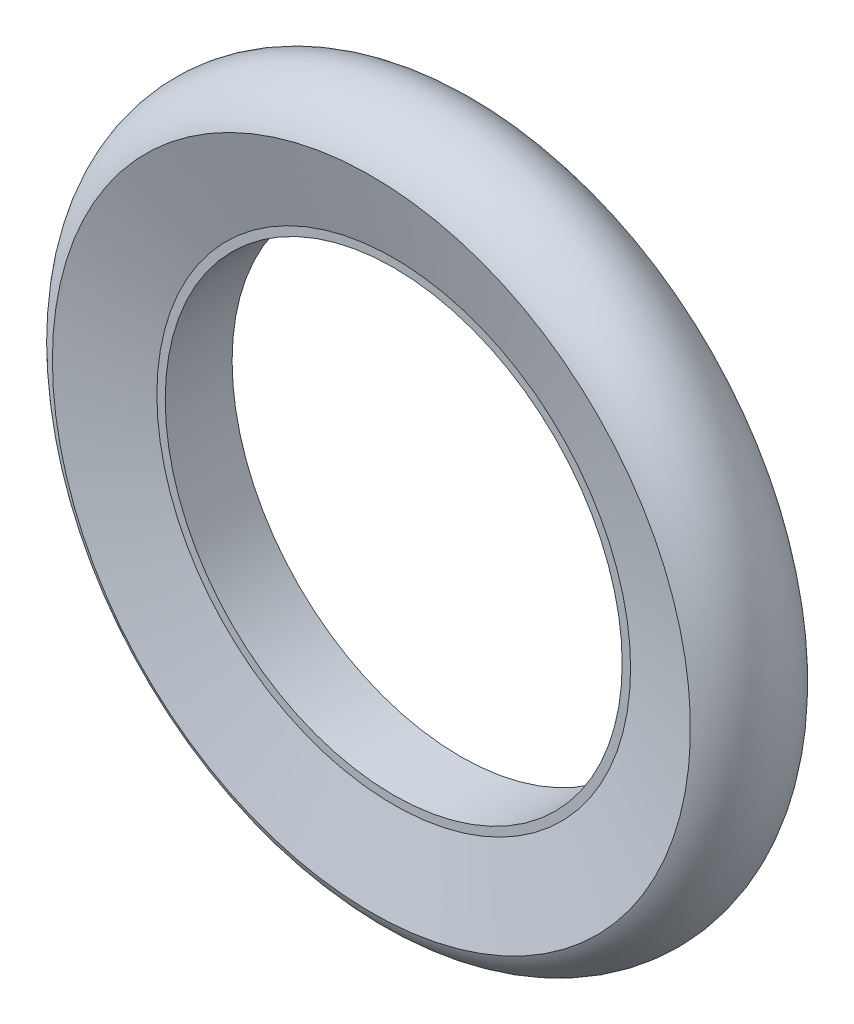
ISO-10303-21;
HEADER;
FILE_DESCRIPTION(('STEP AP214'),'2;1');
FILE_NAME('part.step','',(''),(''),'','','');
FILE_SCHEMA(('AUTOMOTIVE_DESIGN { 1 0 10303 214 1 1 1 1 }'));
ENDSEC;
DATA;
#1=APPLICATION_CONTEXT('core data for automotive mechanical design processes');
#2=APPLICATION_PROTOCOL_DEFINITION('international standard','automotive_design',2000,#1);
#3=PRODUCT_CONTEXT('',#1,'mechanical');
#4=PRODUCT('Part','Part','',(#3));
#5=PRODUCT_RELATED_PRODUCT_CATEGORY('part','',(#4));
#6=PRODUCT_DEFINITION_FORMATION('','',#4);
#7=PRODUCT_DEFINITION_CONTEXT('part definition',#1,'design');
#8=PRODUCT_DEFINITION('design','',#6,#7);
#9=PRODUCT_DEFINITION_SHAPE('','',#8);
#10=(LENGTH_UNIT() NAMED_UNIT(*) SI_UNIT(.MILLI.,.METRE.));
#11=(NAMED_UNIT(*) PLANE_ANGLE_UNIT() SI_UNIT($,.RADIAN.));
#12=(NAMED_UNIT(*) SI_UNIT($,.STERADIAN.) SOLID_ANGLE_UNIT());
#13=UNCERTAINTY_MEASURE_WITH_UNIT(LENGTH_MEASURE(1.E-05),#10,'distance_accuracy_value','');
#14=(GEOMETRIC_REPRESENTATION_CONTEXT(3) GLOBAL_UNCERTAINTY_ASSIGNED_CONTEXT((#13)) GLOBAL_UNIT_ASSIGNED_CONTEXT((#10,
#11,#12)) REPRESENTATION_CONTEXT('',''));
#15=CARTESIAN_POINT('',(0.,0.,0.));
#16=DIRECTION('',(0.,0.,1.));
#17=DIRECTION('',(1.,0.,0.));
#18=AXIS2_PLACEMENT_3D('',#15,#16,#17);
#19=CARTESIAN_POINT('',(0.,0.,0.));
#20=DIRECTION('',(0.,0.,-1.));
#21=DIRECTION('',(-1.,0.,0.));
#22=AXIS2_PLACEMENT_3D('',#19,#20,#21);
#23=TOROIDAL_SURFACE('',#22,211.230769230769,43.7692307692308);
#24=CARTESIAN_POINT('',(0.,0.,-40.));
#25=DIRECTION('',(0.,0.,-1.));
#26=DIRECTION('',(-1.,0.,0.));
#27=AXIS2_PLACEMENT_3D('',#24,#25,#26);
#28=CIRCLE('',#27,229.);
#29=CARTESIAN_POINT('',(-229.,0.,-40.));
#30=VERTEX_POINT('',#29);
#31=EDGE_CURVE('E60',#30,#30,#28,.T.);
#32=ORIENTED_EDGE('',*,*,#31,.F.);
#33=EDGE_LOOP('',(#32));
#34=FACE_BOUND('',#33,.T.);
#35=CARTESIAN_POINT('',(0.,0.,40.));
#36=DIRECTION('',(0.,0.,-1.));
#37=DIRECTION('',(-1.,0.,0.));
#38=AXIS2_PLACEMENT_3D('',#35,#36,#37);
#39=CIRCLE('',#38,229.);
#40=CARTESIAN_POINT('',(-229.,0.,40.));
#41=VERTEX_POINT('',#40);
#42=EDGE_CURVE('E10',#41,#41,#39,.T.);
#43=ORIENTED_EDGE('',*,*,#42,.T.);
#44=EDGE_LOOP('',(#43));
#45=FACE_BOUND('',#44,.T.);
#46=ADVANCED_FACE('F38',(#34,#45),#23,.T.);
#47=CARTESIAN_POINT('',(0.,0.,24.));
#48=DIRECTION('',(0.,0.,1.));
#49=DIRECTION('',(1.,0.,0.));
#50=AXIS2_PLACEMENT_3D('',#47,#48,#49);
#51=CONICAL_SURFACE('',#50,170.,1.30597899688911);
#52=ORIENTED_EDGE('',*,*,#42,.F.);
#53=EDGE_LOOP('',(#52));
#54=FACE_BOUND('',#53,.T.);
#55=CARTESIAN_POINT('',(0.,0.,24.));
#56=DIRECTION('',(0.,0.,-1.));
#57=DIRECTION('',(-1.,0.,0.));
#58=AXIS2_PLACEMENT_3D('',#55,#56,#57);
#59=CIRCLE('',#58,170.);
#60=CARTESIAN_POINT('',(-170.,0.,24.));
#61=VERTEX_POINT('',#60);
#62=EDGE_CURVE('E44',#61,#61,#59,.T.);
#63=ORIENTED_EDGE('',*,*,#62,.T.);
#64=EDGE_LOOP('',(#63));
#65=FACE_BOUND('',#64,.T.);
#66=ADVANCED_FACE('F68',(#54,#65),#51,.F.);
#67=CARTESIAN_POINT('',(0.,0.,24.));
#68=DIRECTION('',(0.,0.,1.));
#69=DIRECTION('',(1.,0.,0.));
#70=AXIS2_PLACEMENT_3D('',#67,#68,#69);
#71=PLANE('',#70);
#72=CARTESIAN_POINT('',(0.,0.,24.));
#73=DIRECTION('',(0.,0.,-1.));
#74=DIRECTION('',(-1.,0.,0.));
#75=AXIS2_PLACEMENT_3D('',#72,#73,#74);
#76=CIRCLE('',#75,164.);
#77=CARTESIAN_POINT('',(-164.,0.,24.));
#78=VERTEX_POINT('',#77);
#79=EDGE_CURVE('E48',#78,#78,#76,.T.);
#80=ORIENTED_EDGE('',*,*,#79,.T.);
#81=EDGE_LOOP('',(#80));
#82=FACE_BOUND('',#81,.T.);
#83=ORIENTED_EDGE('',*,*,#62,.F.);
#84=EDGE_LOOP('',(#83));
#85=FACE_BOUND('',#84,.T.);
#86=ADVANCED_FACE('F72',(#82,#85),#71,.T.);
#87=CARTESIAN_POINT('',(0.,0.,-36.4643216231149));
#88=DIRECTION('',(0.,0.,-1.));
#89=DIRECTION('',(-1.,0.,0.));
#90=AXIS2_PLACEMENT_3D('',#87,#88,#89);
#91=CYLINDRICAL_SURFACE('',#90,164.);
#92=CARTESIAN_POINT('',(0.,0.,-24.));
#93=DIRECTION('',(0.,0.,-1.));
#94=DIRECTION('',(-1.,0.,0.));
#95=AXIS2_PLACEMENT_3D('',#92,#93,#94);
#96=CIRCLE('',#95,164.);
#97=CARTESIAN_POINT('',(-164.,0.,-24.));
#98=VERTEX_POINT('',#97);
#99=EDGE_CURVE('E52',#98,#98,#96,.T.);
#100=ORIENTED_EDGE('',*,*,#99,.T.);
#101=EDGE_LOOP('',(#100));
#102=FACE_BOUND('',#101,.T.);
#103=ORIENTED_EDGE('',*,*,#79,.F.);
#104=EDGE_LOOP('',(#103));
#105=FACE_BOUND('',#104,.T.);
#106=ADVANCED_FACE('F77',(#102,#105),#91,.F.);
#107=CARTESIAN_POINT('',(0.,0.,-24.));
#108=DIRECTION('',(0.,0.,-1.));
#109=DIRECTION('',(-1.,0.,0.));
#110=AXIS2_PLACEMENT_3D('',#107,#108,#109);
#111=PLANE('',#110);
#112=CARTESIAN_POINT('',(0.,0.,-24.));
#113=DIRECTION('',(0.,0.,-1.));
#114=DIRECTION('',(-1.,0.,0.));
#115=AXIS2_PLACEMENT_3D('',#112,#113,#114);
#116=CIRCLE('',#115,170.);
#117=CARTESIAN_POINT('',(-170.,0.,-24.));
#118=VERTEX_POINT('',#117);
#119=EDGE_CURVE('E57',#118,#118,#116,.T.);
#120=ORIENTED_EDGE('',*,*,#119,.T.);
#121=EDGE_LOOP('',(#120));
#122=FACE_BOUND('',#121,.T.);
#123=ORIENTED_EDGE('',*,*,#99,.F.);
#124=EDGE_LOOP('',(#123));
#125=FACE_BOUND('',#124,.T.);
#126=ADVANCED_FACE('F83',(#122,#125),#111,.T.);
#127=CARTESIAN_POINT('',(0.,0.,-24.));
#128=DIRECTION('',(0.,0.,-1.));
#129=DIRECTION('',(-1.,0.,0.));
#130=AXIS2_PLACEMENT_3D('',#127,#128,#129);
#131=CONICAL_SURFACE('',#130,170.,1.30597899688911);
#132=ORIENTED_EDGE('',*,*,#31,.T.);
#133=EDGE_LOOP('',(#132));
#134=FACE_BOUND('',#133,.T.);
#135=ORIENTED_EDGE('',*,*,#119,.F.);
#136=EDGE_LOOP('',(#135));
#137=FACE_BOUND('',#136,.T.);
#138=ADVANCED_FACE('F64',(#134,#137),#131,.F.);
#139=CLOSED_SHELL('',(#46,#66,#86,#106,#126,#138));
#140=MANIFOLD_SOLID_BREP('B2',#139);
#141=ADVANCED_BREP_SHAPE_REPRESENTATION('',(#18,#140),#14);
#142=SHAPE_DEFINITION_REPRESENTATION(#9,#141);
ENDSEC;
END-ISO-10303-21;
